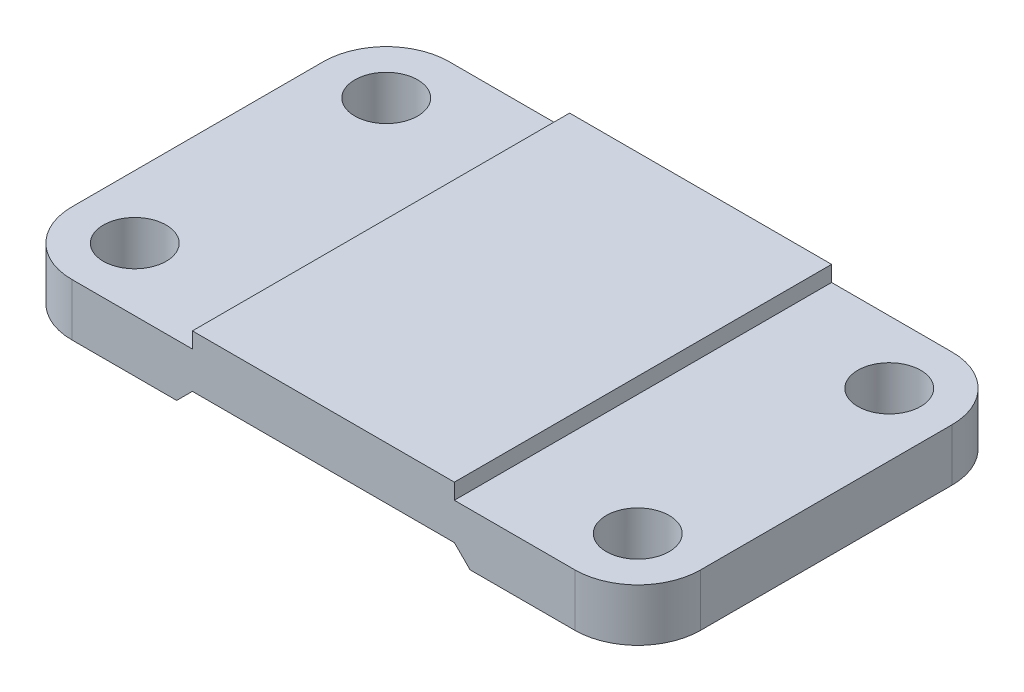
ISO-10303-21;
HEADER;
FILE_DESCRIPTION(('STEP AP214'),'2;1');
FILE_NAME('part.step','',(''),(''),'','','');
FILE_SCHEMA(('AUTOMOTIVE_DESIGN { 1 0 10303 214 1 1 1 1 }'));
ENDSEC;
DATA;
#1=APPLICATION_CONTEXT('core data for automotive mechanical design processes');
#2=APPLICATION_PROTOCOL_DEFINITION('international standard','automotive_design',2000,#1);
#3=PRODUCT_CONTEXT('',#1,'mechanical');
#4=PRODUCT('Part','Part','',(#3));
#5=PRODUCT_RELATED_PRODUCT_CATEGORY('part','',(#4));
#6=PRODUCT_DEFINITION_FORMATION('','',#4);
#7=PRODUCT_DEFINITION_CONTEXT('part definition',#1,'design');
#8=PRODUCT_DEFINITION('design','',#6,#7);
#9=PRODUCT_DEFINITION_SHAPE('','',#8);
#10=(LENGTH_UNIT() NAMED_UNIT(*) SI_UNIT(.MILLI.,.METRE.));
#11=(NAMED_UNIT(*) PLANE_ANGLE_UNIT() SI_UNIT($,.RADIAN.));
#12=(NAMED_UNIT(*) SI_UNIT($,.STERADIAN.) SOLID_ANGLE_UNIT());
#13=UNCERTAINTY_MEASURE_WITH_UNIT(LENGTH_MEASURE(1.E-05),#10,'distance_accuracy_value','');
#14=(GEOMETRIC_REPRESENTATION_CONTEXT(3) GLOBAL_UNCERTAINTY_ASSIGNED_CONTEXT((#13)) GLOBAL_UNIT_ASSIGNED_CONTEXT((#10,
#11,#12)) REPRESENTATION_CONTEXT('',''));
#15=CARTESIAN_POINT('',(0.,0.,0.));
#16=DIRECTION('',(0.,0.,1.));
#17=DIRECTION('',(1.,0.,0.));
#18=AXIS2_PLACEMENT_3D('',#15,#16,#17);
#19=CARTESIAN_POINT('',(32.,0.,72.));
#20=DIRECTION('',(0.,1.,0.));
#21=DIRECTION('',(0.,0.,1.));
#22=AXIS2_PLACEMENT_3D('',#19,#20,#21);
#23=PLANE('',#22);
#24=CARTESIAN_POINT('',(12.,0.,60.));
#25=DIRECTION('',(0.,1.,0.));
#26=DIRECTION('',(0.,0.,1.));
#27=AXIS2_PLACEMENT_3D('',#24,#25,#26);
#28=CIRCLE('',#27,6.);
#29=CARTESIAN_POINT('',(12.,0.,66.));
#30=VERTEX_POINT('',#29);
#31=EDGE_CURVE('E361',#30,#30,#28,.T.);
#32=ORIENTED_EDGE('',*,*,#31,.T.);
#33=EDGE_LOOP('',(#32));
#34=FACE_BOUND('',#33,.T.);
#35=CARTESIAN_POINT('',(12.,0.,12.));
#36=DIRECTION('',(0.,1.,0.));
#37=DIRECTION('',(0.,0.,1.));
#38=AXIS2_PLACEMENT_3D('',#35,#36,#37);
#39=CIRCLE('',#38,6.);
#40=CARTESIAN_POINT('',(12.,0.,18.));
#41=VERTEX_POINT('',#40);
#42=EDGE_CURVE('E352',#41,#41,#39,.T.);
#43=ORIENTED_EDGE('',*,*,#42,.T.);
#44=EDGE_LOOP('',(#43));
#45=FACE_BOUND('',#44,.T.);
#46=CARTESIAN_POINT('',(12.,0.,60.));
#47=DIRECTION('',(0.,1.,0.));
#48=DIRECTION('',(0.,0.,1.));
#49=AXIS2_PLACEMENT_3D('',#46,#47,#48);
#50=CIRCLE('',#49,12.);
#51=CARTESIAN_POINT('',(0.,0.,59.9999999999999));
#52=VERTEX_POINT('',#51);
#53=CARTESIAN_POINT('',(12.,0.,72.));
#54=VERTEX_POINT('',#53);
#55=EDGE_CURVE('E109',#52,#54,#50,.T.);
#56=ORIENTED_EDGE('',*,*,#55,.F.);
#57=DIRECTION('',(0.,0.,-1.));
#58=VECTOR('',#57,1.);
#59=CARTESIAN_POINT('',(0.,0.,72.));
#60=LINE('',#59,#58);
#61=CARTESIAN_POINT('',(0.,0.,12.0000000000001));
#62=VERTEX_POINT('',#61);
#63=EDGE_CURVE('E249',#52,#62,#60,.T.);
#64=ORIENTED_EDGE('',*,*,#63,.T.);
#65=CARTESIAN_POINT('',(12.,0.,12.));
#66=DIRECTION('',(0.,1.,0.));
#67=DIRECTION('',(0.,0.,1.));
#68=AXIS2_PLACEMENT_3D('',#65,#66,#67);
#69=CIRCLE('',#68,12.);
#70=CARTESIAN_POINT('',(12.0000000000001,0.,0.));
#71=VERTEX_POINT('',#70);
#72=EDGE_CURVE('E354',#71,#62,#69,.T.);
#73=ORIENTED_EDGE('',*,*,#72,.F.);
#74=DIRECTION('',(1.,0.,0.));
#75=VECTOR('',#74,1.);
#76=CARTESIAN_POINT('',(32.,0.,0.));
#77=LINE('',#76,#75);
#78=CARTESIAN_POINT('',(32.,0.,0.));
#79=VERTEX_POINT('',#78);
#80=EDGE_CURVE('E326',#71,#79,#77,.T.);
#81=ORIENTED_EDGE('',*,*,#80,.T.);
#82=DIRECTION('',(0.,0.,-1.));
#83=VECTOR('',#82,1.);
#84=CARTESIAN_POINT('',(32.,0.,72.));
#85=LINE('',#84,#83);
#86=CARTESIAN_POINT('',(32.,0.,72.));
#87=VERTEX_POINT('',#86);
#88=EDGE_CURVE('E291',#87,#79,#85,.T.);
#89=ORIENTED_EDGE('',*,*,#88,.F.);
#90=DIRECTION('',(1.,0.,0.));
#91=VECTOR('',#90,1.);
#92=CARTESIAN_POINT('',(32.,0.,72.));
#93=LINE('',#92,#91);
#94=EDGE_CURVE('E248',#54,#87,#93,.T.);
#95=ORIENTED_EDGE('',*,*,#94,.F.);
#96=EDGE_LOOP('',(#56,#64,#73,#81,#89,#95));
#97=FACE_BOUND('',#96,.T.);
#98=ADVANCED_FACE('F87',(#34,#45,#97),#23,.F.);
#99=CARTESIAN_POINT('',(120.,0.,72.));
#100=DIRECTION('',(0.,1.,0.));
#101=DIRECTION('',(-1.,0.,0.));
#102=AXIS2_PLACEMENT_3D('',#99,#100,#101);
#103=PLANE('',#102);
#104=CARTESIAN_POINT('',(108.,0.,12.));
#105=DIRECTION('',(0.,1.,0.));
#106=DIRECTION('',(-1.,0.,0.));
#107=AXIS2_PLACEMENT_3D('',#104,#105,#106);
#108=CIRCLE('',#107,6.);
#109=CARTESIAN_POINT('',(102.,0.,12.));
#110=VERTEX_POINT('',#109);
#111=EDGE_CURVE('E365',#110,#110,#108,.T.);
#112=ORIENTED_EDGE('',*,*,#111,.T.);
#113=EDGE_LOOP('',(#112));
#114=FACE_BOUND('',#113,.T.);
#115=CARTESIAN_POINT('',(108.,0.,60.));
#116=DIRECTION('',(0.,1.,0.));
#117=DIRECTION('',(-1.,0.,0.));
#118=AXIS2_PLACEMENT_3D('',#115,#116,#117);
#119=CIRCLE('',#118,6.);
#120=CARTESIAN_POINT('',(102.,0.,60.));
#121=VERTEX_POINT('',#120);
#122=EDGE_CURVE('E330',#121,#121,#119,.T.);
#123=ORIENTED_EDGE('',*,*,#122,.T.);
#124=EDGE_LOOP('',(#123));
#125=FACE_BOUND('',#124,.T.);
#126=DIRECTION('',(1.,0.,0.));
#127=VECTOR('',#126,1.);
#128=CARTESIAN_POINT('',(120.,0.,0.));
#129=LINE('',#128,#127);
#130=CARTESIAN_POINT('',(88.,0.,0.));
#131=VERTEX_POINT('',#130);
#132=CARTESIAN_POINT('',(108.,0.,0.));
#133=VERTEX_POINT('',#132);
#134=EDGE_CURVE('E229',#131,#133,#129,.T.);
#135=ORIENTED_EDGE('',*,*,#134,.T.);
#136=CARTESIAN_POINT('',(108.,0.,12.));
#137=DIRECTION('',(0.,1.,0.));
#138=DIRECTION('',(-1.,0.,0.));
#139=AXIS2_PLACEMENT_3D('',#136,#137,#138);
#140=CIRCLE('',#139,12.);
#141=CARTESIAN_POINT('',(120.,0.,12.0000000000001));
#142=VERTEX_POINT('',#141);
#143=EDGE_CURVE('E204',#133,#142,#140,.F.);
#144=ORIENTED_EDGE('',*,*,#143,.T.);
#145=DIRECTION('',(0.,0.,-1.));
#146=VECTOR('',#145,1.);
#147=CARTESIAN_POINT('',(120.,0.,72.));
#148=LINE('',#147,#146);
#149=CARTESIAN_POINT('',(120.,0.,59.9999999999999));
#150=VERTEX_POINT('',#149);
#151=EDGE_CURVE('E275',#150,#142,#148,.T.);
#152=ORIENTED_EDGE('',*,*,#151,.F.);
#153=CARTESIAN_POINT('',(108.,0.,60.));
#154=DIRECTION('',(0.,1.,0.));
#155=DIRECTION('',(-1.,0.,0.));
#156=AXIS2_PLACEMENT_3D('',#153,#154,#155);
#157=CIRCLE('',#156,12.);
#158=CARTESIAN_POINT('',(108.,0.,72.));
#159=VERTEX_POINT('',#158);
#160=EDGE_CURVE('E346',#159,#150,#157,.T.);
#161=ORIENTED_EDGE('',*,*,#160,.F.);
#162=DIRECTION('',(1.,0.,0.));
#163=VECTOR('',#162,1.);
#164=CARTESIAN_POINT('',(120.,0.,72.));
#165=LINE('',#164,#163);
#166=CARTESIAN_POINT('',(88.,0.,72.));
#167=VERTEX_POINT('',#166);
#168=EDGE_CURVE('E304',#167,#159,#165,.T.);
#169=ORIENTED_EDGE('',*,*,#168,.F.);
#170=DIRECTION('',(0.,0.,-1.));
#171=VECTOR('',#170,1.);
#172=CARTESIAN_POINT('',(88.,0.,72.));
#173=LINE('',#172,#171);
#174=EDGE_CURVE('E279',#167,#131,#173,.T.);
#175=ORIENTED_EDGE('',*,*,#174,.T.);
#176=EDGE_LOOP('',(#135,#144,#152,#161,#169,#175));
#177=FACE_BOUND('',#176,.T.);
#178=ADVANCED_FACE('F344',(#114,#125,#177),#103,.F.);
#179=CARTESIAN_POINT('',(120.,10.,72.));
#180=DIRECTION('',(-1.,0.,0.));
#181=DIRECTION('',(0.,0.,1.));
#182=AXIS2_PLACEMENT_3D('',#179,#180,#181);
#183=PLANE('',#182);
#184=DIRECTION('',(0.,1.,0.));
#185=VECTOR('',#184,1.);
#186=CARTESIAN_POINT('',(120.,-62.,12.0000000000001));
#187=LINE('',#186,#185);
#188=CARTESIAN_POINT('',(120.,10.,12.0000000000001));
#189=VERTEX_POINT('',#188);
#190=EDGE_CURVE('E221',#142,#189,#187,.T.);
#191=ORIENTED_EDGE('',*,*,#190,.T.);
#192=DIRECTION('',(0.,0.,-1.));
#193=VECTOR('',#192,1.);
#194=CARTESIAN_POINT('',(120.,10.,72.));
#195=LINE('',#194,#193);
#196=CARTESIAN_POINT('',(120.,10.,59.9999999999999));
#197=VERTEX_POINT('',#196);
#198=EDGE_CURVE('E219',#197,#189,#195,.T.);
#199=ORIENTED_EDGE('',*,*,#198,.F.);
#200=DIRECTION('',(0.,1.,0.));
#201=VECTOR('',#200,1.);
#202=CARTESIAN_POINT('',(120.,-62.,59.9999999999999));
#203=LINE('',#202,#201);
#204=EDGE_CURVE('E222',#150,#197,#203,.T.);
#205=ORIENTED_EDGE('',*,*,#204,.F.);
#206=ORIENTED_EDGE('',*,*,#151,.T.);
#207=EDGE_LOOP('',(#191,#199,#205,#206));
#208=FACE_BOUND('',#207,.T.);
#209=ADVANCED_FACE('F441',(#208),#183,.F.);
#210=CARTESIAN_POINT('',(85.,10.,72.));
#211=DIRECTION('',(0.,-1.,0.));
#212=DIRECTION('',(0.,0.,-1.));
#213=AXIS2_PLACEMENT_3D('',#210,#211,#212);
#214=PLANE('',#213);
#215=CARTESIAN_POINT('',(108.,10.,12.));
#216=DIRECTION('',(0.,1.,0.));
#217=DIRECTION('',(0.,0.,1.));
#218=AXIS2_PLACEMENT_3D('',#215,#216,#217);
#219=CIRCLE('',#218,6.);
#220=CARTESIAN_POINT('',(108.,10.,18.));
#221=VERTEX_POINT('',#220);
#222=EDGE_CURVE('E414',#221,#221,#219,.T.);
#223=ORIENTED_EDGE('',*,*,#222,.F.);
#224=EDGE_LOOP('',(#223));
#225=FACE_BOUND('',#224,.T.);
#226=CARTESIAN_POINT('',(108.,10.,60.));
#227=DIRECTION('',(0.,1.,0.));
#228=DIRECTION('',(0.,0.,1.));
#229=AXIS2_PLACEMENT_3D('',#226,#227,#228);
#230=CIRCLE('',#229,6.);
#231=CARTESIAN_POINT('',(108.,10.,66.));
#232=VERTEX_POINT('',#231);
#233=EDGE_CURVE('E426',#232,#232,#230,.T.);
#234=ORIENTED_EDGE('',*,*,#233,.F.);
#235=EDGE_LOOP('',(#234));
#236=FACE_BOUND('',#235,.T.);
#237=ORIENTED_EDGE('',*,*,#198,.T.);
#238=CARTESIAN_POINT('',(108.,10.,12.));
#239=DIRECTION('',(0.,1.,0.));
#240=DIRECTION('',(0.,0.,1.));
#241=AXIS2_PLACEMENT_3D('',#238,#239,#240);
#242=CIRCLE('',#241,12.);
#243=CARTESIAN_POINT('',(108.,10.,0.));
#244=VERTEX_POINT('',#243);
#245=EDGE_CURVE('E201',#244,#189,#242,.F.);
#246=ORIENTED_EDGE('',*,*,#245,.F.);
#247=DIRECTION('',(-1.,0.,0.));
#248=VECTOR('',#247,1.);
#249=CARTESIAN_POINT('',(85.,10.,0.));
#250=LINE('',#249,#248);
#251=CARTESIAN_POINT('',(85.,10.,0.));
#252=VERTEX_POINT('',#251);
#253=EDGE_CURVE('E216',#244,#252,#250,.T.);
#254=ORIENTED_EDGE('',*,*,#253,.T.);
#255=DIRECTION('',(0.,0.,-1.));
#256=VECTOR('',#255,1.);
#257=CARTESIAN_POINT('',(85.,10.,72.));
#258=LINE('',#257,#256);
#259=CARTESIAN_POINT('',(85.,10.,72.));
#260=VERTEX_POINT('',#259);
#261=EDGE_CURVE('E270',#260,#252,#258,.T.);
#262=ORIENTED_EDGE('',*,*,#261,.F.);
#263=DIRECTION('',(-1.,0.,0.));
#264=VECTOR('',#263,1.);
#265=CARTESIAN_POINT('',(85.,10.,72.));
#266=LINE('',#265,#264);
#267=CARTESIAN_POINT('',(108.,10.,72.));
#268=VERTEX_POINT('',#267);
#269=EDGE_CURVE('E302',#268,#260,#266,.T.);
#270=ORIENTED_EDGE('',*,*,#269,.F.);
#271=CARTESIAN_POINT('',(108.,10.,60.));
#272=DIRECTION('',(0.,1.,0.));
#273=DIRECTION('',(0.,0.,1.));
#274=AXIS2_PLACEMENT_3D('',#271,#272,#273);
#275=CIRCLE('',#274,12.);
#276=EDGE_CURVE('E102',#268,#197,#275,.T.);
#277=ORIENTED_EDGE('',*,*,#276,.T.);
#278=EDGE_LOOP('',(#237,#246,#254,#262,#270,#277));
#279=FACE_BOUND('',#278,.T.);
#280=ADVANCED_FACE('F214',(#225,#236,#279),#214,.F.);
#281=CARTESIAN_POINT('',(0.,10.,72.));
#282=DIRECTION('',(0.,-1.,0.));
#283=DIRECTION('',(0.,0.,-1.));
#284=AXIS2_PLACEMENT_3D('',#281,#282,#283);
#285=PLANE('',#284);
#286=CARTESIAN_POINT('',(12.,10.,60.));
#287=DIRECTION('',(0.,1.,0.));
#288=DIRECTION('',(0.,0.,1.));
#289=AXIS2_PLACEMENT_3D('',#286,#287,#288);
#290=CIRCLE('',#289,6.);
#291=CARTESIAN_POINT('',(12.,10.,66.));
#292=VERTEX_POINT('',#291);
#293=EDGE_CURVE('E409',#292,#292,#290,.T.);
#294=ORIENTED_EDGE('',*,*,#293,.F.);
#295=EDGE_LOOP('',(#294));
#296=FACE_BOUND('',#295,.T.);
#297=CARTESIAN_POINT('',(12.,10.,12.));
#298=DIRECTION('',(0.,1.,0.));
#299=DIRECTION('',(0.,0.,1.));
#300=AXIS2_PLACEMENT_3D('',#297,#298,#299);
#301=CIRCLE('',#300,6.);
#302=CARTESIAN_POINT('',(12.,10.,18.));
#303=VERTEX_POINT('',#302);
#304=EDGE_CURVE('E405',#303,#303,#301,.T.);
#305=ORIENTED_EDGE('',*,*,#304,.F.);
#306=EDGE_LOOP('',(#305));
#307=FACE_BOUND('',#306,.T.);
#308=CARTESIAN_POINT('',(12.,10.,60.));
#309=DIRECTION('',(0.,1.,0.));
#310=DIRECTION('',(0.,0.,1.));
#311=AXIS2_PLACEMENT_3D('',#308,#309,#310);
#312=CIRCLE('',#311,12.);
#313=CARTESIAN_POINT('',(0.,10.,59.9999999999999));
#314=VERTEX_POINT('',#313);
#315=CARTESIAN_POINT('',(12.0000000000001,10.,72.));
#316=VERTEX_POINT('',#315);
#317=EDGE_CURVE('E418',#314,#316,#312,.T.);
#318=ORIENTED_EDGE('',*,*,#317,.T.);
#319=DIRECTION('',(-1.,0.,0.));
#320=VECTOR('',#319,1.);
#321=CARTESIAN_POINT('',(0.,10.,72.));
#322=LINE('',#321,#320);
#323=CARTESIAN_POINT('',(35.,10.,72.));
#324=VERTEX_POINT('',#323);
#325=EDGE_CURVE('E254',#324,#316,#322,.T.);
#326=ORIENTED_EDGE('',*,*,#325,.F.);
#327=DIRECTION('',(0.,0.,-1.));
#328=VECTOR('',#327,1.);
#329=CARTESIAN_POINT('',(35.,10.,72.));
#330=LINE('',#329,#328);
#331=CARTESIAN_POINT('',(35.,10.,0.));
#332=VERTEX_POINT('',#331);
#333=EDGE_CURVE('E258',#324,#332,#330,.T.);
#334=ORIENTED_EDGE('',*,*,#333,.T.);
#335=DIRECTION('',(-1.,0.,0.));
#336=VECTOR('',#335,1.);
#337=CARTESIAN_POINT('',(0.,10.,0.));
#338=LINE('',#337,#336);
#339=CARTESIAN_POINT('',(12.0000000000001,10.,0.));
#340=VERTEX_POINT('',#339);
#341=EDGE_CURVE('E244',#332,#340,#338,.T.);
#342=ORIENTED_EDGE('',*,*,#341,.T.);
#343=CARTESIAN_POINT('',(12.,10.,12.));
#344=DIRECTION('',(0.,1.,0.));
#345=DIRECTION('',(0.,0.,1.));
#346=AXIS2_PLACEMENT_3D('',#343,#344,#345);
#347=CIRCLE('',#346,12.);
#348=CARTESIAN_POINT('',(0.,10.,12.0000000000001));
#349=VERTEX_POINT('',#348);
#350=EDGE_CURVE('E399',#340,#349,#347,.T.);
#351=ORIENTED_EDGE('',*,*,#350,.T.);
#352=DIRECTION('',(0.,0.,-1.));
#353=VECTOR('',#352,1.);
#354=CARTESIAN_POINT('',(0.,10.,72.));
#355=LINE('',#354,#353);
#356=EDGE_CURVE('E253',#314,#349,#355,.T.);
#357=ORIENTED_EDGE('',*,*,#356,.F.);
#358=EDGE_LOOP('',(#318,#326,#334,#342,#351,#357));
#359=FACE_BOUND('',#358,.T.);
#360=ADVANCED_FACE('F440',(#296,#307,#359),#285,.F.);
#361=CARTESIAN_POINT('',(0.,0.,72.));
#362=DIRECTION('',(1.,0.,0.));
#363=DIRECTION('',(0.,0.,-1.));
#364=AXIS2_PLACEMENT_3D('',#361,#362,#363);
#365=PLANE('',#364);
#366=ORIENTED_EDGE('',*,*,#63,.F.);
#367=DIRECTION('',(0.,1.,0.));
#368=VECTOR('',#367,1.);
#369=CARTESIAN_POINT('',(0.,-62.,59.9999999999999));
#370=LINE('',#369,#368);
#371=EDGE_CURVE('E410',#52,#314,#370,.T.);
#372=ORIENTED_EDGE('',*,*,#371,.T.);
#373=ORIENTED_EDGE('',*,*,#356,.T.);
#374=DIRECTION('',(0.,1.,0.));
#375=VECTOR('',#374,1.);
#376=CARTESIAN_POINT('',(0.,-62.,12.0000000000001));
#377=LINE('',#376,#375);
#378=EDGE_CURVE('E397',#62,#349,#377,.T.);
#379=ORIENTED_EDGE('',*,*,#378,.F.);
#380=EDGE_LOOP('',(#366,#372,#373,#379));
#381=FACE_BOUND('',#380,.T.);
#382=ADVANCED_FACE('F448',(#381),#365,.F.);
#383=CARTESIAN_POINT('',(0.,0.,72.));
#384=DIRECTION('',(0.,0.,-1.));
#385=DIRECTION('',(-1.,0.,0.));
#386=AXIS2_PLACEMENT_3D('',#383,#384,#385);
#387=PLANE('',#386);
#388=DIRECTION('',(0.,1.,0.));
#389=VECTOR('',#388,1.);
#390=CARTESIAN_POINT('',(12.,-62.,72.));
#391=LINE('',#390,#389);
#392=EDGE_CURVE('E12',#54,#316,#391,.T.);
#393=ORIENTED_EDGE('',*,*,#392,.F.);
#394=ORIENTED_EDGE('',*,*,#94,.T.);
#395=DIRECTION('',(0.707106781186547,0.707106781186548,0.));
#396=VECTOR('',#395,1.);
#397=CARTESIAN_POINT('',(35.,3.00000000000001,72.));
#398=LINE('',#397,#396);
#399=CARTESIAN_POINT('',(35.,3.00000000000001,72.));
#400=VERTEX_POINT('',#399);
#401=EDGE_CURVE('E374',#87,#400,#398,.T.);
#402=ORIENTED_EDGE('',*,*,#401,.T.);
#403=DIRECTION('',(1.,0.,0.));
#404=VECTOR('',#403,1.);
#405=CARTESIAN_POINT('',(85.,3.00000000000001,72.));
#406=LINE('',#405,#404);
#407=CARTESIAN_POINT('',(85.,3.00000000000001,72.));
#408=VERTEX_POINT('',#407);
#409=EDGE_CURVE('E377',#400,#408,#406,.T.);
#410=ORIENTED_EDGE('',*,*,#409,.T.);
#411=DIRECTION('',(0.707106781186546,-0.707106781186549,0.));
#412=VECTOR('',#411,1.);
#413=CARTESIAN_POINT('',(88.,0.,72.));
#414=LINE('',#413,#412);
#415=EDGE_CURVE('E314',#408,#167,#414,.T.);
#416=ORIENTED_EDGE('',*,*,#415,.T.);
#417=ORIENTED_EDGE('',*,*,#168,.T.);
#418=DIRECTION('',(0.,1.,0.));
#419=VECTOR('',#418,1.);
#420=CARTESIAN_POINT('',(108.,-62.,72.));
#421=LINE('',#420,#419);
#422=EDGE_CURVE('E95',#159,#268,#421,.T.);
#423=ORIENTED_EDGE('',*,*,#422,.T.);
#424=ORIENTED_EDGE('',*,*,#269,.T.);
#425=DIRECTION('',(0.,1.,0.));
#426=VECTOR('',#425,1.);
#427=CARTESIAN_POINT('',(85.,13.,72.));
#428=LINE('',#427,#426);
#429=CARTESIAN_POINT('',(85.,13.,72.));
#430=VERTEX_POINT('',#429);
#431=EDGE_CURVE('E308',#260,#430,#428,.T.);
#432=ORIENTED_EDGE('',*,*,#431,.T.);
#433=DIRECTION('',(-1.,0.,0.));
#434=VECTOR('',#433,1.);
#435=CARTESIAN_POINT('',(35.,13.,72.));
#436=LINE('',#435,#434);
#437=CARTESIAN_POINT('',(35.,13.,72.));
#438=VERTEX_POINT('',#437);
#439=EDGE_CURVE('E312',#430,#438,#436,.T.);
#440=ORIENTED_EDGE('',*,*,#439,.T.);
#441=DIRECTION('',(0.,-1.,0.));
#442=VECTOR('',#441,1.);
#443=CARTESIAN_POINT('',(35.,10.,72.));
#444=LINE('',#443,#442);
#445=EDGE_CURVE('E320',#438,#324,#444,.T.);
#446=ORIENTED_EDGE('',*,*,#445,.T.);
#447=ORIENTED_EDGE('',*,*,#325,.T.);
#448=EDGE_LOOP('',(#393,#394,#402,#410,#416,#417,#423,#424,#432,#440,#446,#447));
#449=FACE_BOUND('',#448,.T.);
#450=ADVANCED_FACE('F301',(#449),#387,.F.);
#451=CARTESIAN_POINT('',(0.,0.,0.));
#452=DIRECTION('',(0.,0.,-1.));
#453=DIRECTION('',(-1.,0.,0.));
#454=AXIS2_PLACEMENT_3D('',#451,#452,#453);
#455=PLANE('',#454);
#456=ORIENTED_EDGE('',*,*,#253,.F.);
#457=DIRECTION('',(0.,1.,0.));
#458=VECTOR('',#457,1.);
#459=CARTESIAN_POINT('',(108.,-62.,0.));
#460=LINE('',#459,#458);
#461=EDGE_CURVE('E198',#244,#133,#460,.F.);
#462=ORIENTED_EDGE('',*,*,#461,.T.);
#463=ORIENTED_EDGE('',*,*,#134,.F.);
#464=DIRECTION('',(0.707106781186546,-0.707106781186549,0.));
#465=VECTOR('',#464,1.);
#466=CARTESIAN_POINT('',(88.,0.,0.));
#467=LINE('',#466,#465);
#468=CARTESIAN_POINT('',(85.,3.00000000000001,0.));
#469=VERTEX_POINT('',#468);
#470=EDGE_CURVE('E235',#469,#131,#467,.T.);
#471=ORIENTED_EDGE('',*,*,#470,.F.);
#472=DIRECTION('',(1.,0.,0.));
#473=VECTOR('',#472,1.);
#474=CARTESIAN_POINT('',(85.,3.00000000000001,0.));
#475=LINE('',#474,#473);
#476=CARTESIAN_POINT('',(35.,3.00000000000001,0.));
#477=VERTEX_POINT('',#476);
#478=EDGE_CURVE('E333',#477,#469,#475,.T.);
#479=ORIENTED_EDGE('',*,*,#478,.F.);
#480=DIRECTION('',(0.707106781186547,0.707106781186548,0.));
#481=VECTOR('',#480,1.);
#482=CARTESIAN_POINT('',(35.,3.00000000000001,0.));
#483=LINE('',#482,#481);
#484=EDGE_CURVE('E329',#79,#477,#483,.T.);
#485=ORIENTED_EDGE('',*,*,#484,.F.);
#486=ORIENTED_EDGE('',*,*,#80,.F.);
#487=DIRECTION('',(0.,1.,0.));
#488=VECTOR('',#487,1.);
#489=CARTESIAN_POINT('',(12.,-62.,0.));
#490=LINE('',#489,#488);
#491=EDGE_CURVE('E210',#71,#340,#490,.T.);
#492=ORIENTED_EDGE('',*,*,#491,.T.);
#493=ORIENTED_EDGE('',*,*,#341,.F.);
#494=DIRECTION('',(0.,-1.,0.));
#495=VECTOR('',#494,1.);
#496=CARTESIAN_POINT('',(35.,10.,0.));
#497=LINE('',#496,#495);
#498=CARTESIAN_POINT('',(35.,13.,0.));
#499=VERTEX_POINT('',#498);
#500=EDGE_CURVE('E241',#499,#332,#497,.T.);
#501=ORIENTED_EDGE('',*,*,#500,.F.);
#502=DIRECTION('',(-1.,0.,0.));
#503=VECTOR('',#502,1.);
#504=CARTESIAN_POINT('',(35.,13.,0.));
#505=LINE('',#504,#503);
#506=CARTESIAN_POINT('',(85.,13.,0.));
#507=VERTEX_POINT('',#506);
#508=EDGE_CURVE('E233',#507,#499,#505,.T.);
#509=ORIENTED_EDGE('',*,*,#508,.F.);
#510=DIRECTION('',(0.,1.,0.));
#511=VECTOR('',#510,1.);
#512=CARTESIAN_POINT('',(85.,13.,0.));
#513=LINE('',#512,#511);
#514=EDGE_CURVE('E227',#252,#507,#513,.T.);
#515=ORIENTED_EDGE('',*,*,#514,.F.);
#516=EDGE_LOOP('',(#456,#462,#463,#471,#479,#485,#486,#492,#493,#501,#509,#515));
#517=FACE_BOUND('',#516,.T.);
#518=ADVANCED_FACE('F225',(#517),#455,.T.);
#519=CARTESIAN_POINT('',(35.,3.00000000000001,72.));
#520=DIRECTION('',(-0.707106781186548,0.707106781186547,0.));
#521=DIRECTION('',(-0.707106781186547,-0.707106781186548,0.));
#522=AXIS2_PLACEMENT_3D('',#519,#520,#521);
#523=PLANE('',#522);
#524=ORIENTED_EDGE('',*,*,#484,.T.);
#525=DIRECTION('',(0.,0.,-1.));
#526=VECTOR('',#525,1.);
#527=CARTESIAN_POINT('',(35.,3.00000000000001,72.));
#528=LINE('',#527,#526);
#529=EDGE_CURVE('E287',#400,#477,#528,.T.);
#530=ORIENTED_EDGE('',*,*,#529,.F.);
#531=ORIENTED_EDGE('',*,*,#401,.F.);
#532=ORIENTED_EDGE('',*,*,#88,.T.);
#533=EDGE_LOOP('',(#524,#530,#531,#532));
#534=FACE_BOUND('',#533,.T.);
#535=ADVANCED_FACE('F389',(#534),#523,.F.);
#536=CARTESIAN_POINT('',(85.,3.00000000000001,72.));
#537=DIRECTION('',(0.,1.,0.));
#538=DIRECTION('',(-1.,0.,0.));
#539=AXIS2_PLACEMENT_3D('',#536,#537,#538);
#540=PLANE('',#539);
#541=ORIENTED_EDGE('',*,*,#478,.T.);
#542=DIRECTION('',(0.,0.,-1.));
#543=VECTOR('',#542,1.);
#544=CARTESIAN_POINT('',(85.,3.00000000000001,72.));
#545=LINE('',#544,#543);
#546=EDGE_CURVE('E283',#408,#469,#545,.T.);
#547=ORIENTED_EDGE('',*,*,#546,.F.);
#548=ORIENTED_EDGE('',*,*,#409,.F.);
#549=ORIENTED_EDGE('',*,*,#529,.T.);
#550=EDGE_LOOP('',(#541,#547,#548,#549));
#551=FACE_BOUND('',#550,.T.);
#552=ADVANCED_FACE('F384',(#551),#540,.F.);
#553=CARTESIAN_POINT('',(88.,0.,72.));
#554=DIRECTION('',(0.707106781186549,0.707106781186546,0.));
#555=DIRECTION('',(-0.707106781186546,0.707106781186549,0.));
#556=AXIS2_PLACEMENT_3D('',#553,#554,#555);
#557=PLANE('',#556);
#558=ORIENTED_EDGE('',*,*,#470,.T.);
#559=ORIENTED_EDGE('',*,*,#174,.F.);
#560=ORIENTED_EDGE('',*,*,#415,.F.);
#561=ORIENTED_EDGE('',*,*,#546,.T.);
#562=EDGE_LOOP('',(#558,#559,#560,#561));
#563=FACE_BOUND('',#562,.T.);
#564=ADVANCED_FACE('F339',(#563),#557,.F.);
#565=CARTESIAN_POINT('',(85.,13.,72.));
#566=DIRECTION('',(-1.,0.,0.));
#567=DIRECTION('',(0.,0.,1.));
#568=AXIS2_PLACEMENT_3D('',#565,#566,#567);
#569=PLANE('',#568);
#570=ORIENTED_EDGE('',*,*,#514,.T.);
#571=DIRECTION('',(0.,0.,-1.));
#572=VECTOR('',#571,1.);
#573=CARTESIAN_POINT('',(85.,13.,72.));
#574=LINE('',#573,#572);
#575=EDGE_CURVE('E266',#430,#507,#574,.T.);
#576=ORIENTED_EDGE('',*,*,#575,.F.);
#577=ORIENTED_EDGE('',*,*,#431,.F.);
#578=ORIENTED_EDGE('',*,*,#261,.T.);
#579=EDGE_LOOP('',(#570,#576,#577,#578));
#580=FACE_BOUND('',#579,.T.);
#581=ADVANCED_FACE('F498',(#580),#569,.F.);
#582=CARTESIAN_POINT('',(35.,13.,72.));
#583=DIRECTION('',(0.,-1.,0.));
#584=DIRECTION('',(0.,0.,-1.));
#585=AXIS2_PLACEMENT_3D('',#582,#583,#584);
#586=PLANE('',#585);
#587=ORIENTED_EDGE('',*,*,#508,.T.);
#588=DIRECTION('',(0.,0.,-1.));
#589=VECTOR('',#588,1.);
#590=CARTESIAN_POINT('',(35.,13.,72.));
#591=LINE('',#590,#589);
#592=EDGE_CURVE('E262',#438,#499,#591,.T.);
#593=ORIENTED_EDGE('',*,*,#592,.F.);
#594=ORIENTED_EDGE('',*,*,#439,.F.);
#595=ORIENTED_EDGE('',*,*,#575,.T.);
#596=EDGE_LOOP('',(#587,#593,#594,#595));
#597=FACE_BOUND('',#596,.T.);
#598=ADVANCED_FACE('F495',(#597),#586,.F.);
#599=CARTESIAN_POINT('',(35.,10.,72.));
#600=DIRECTION('',(1.,0.,0.));
#601=DIRECTION('',(0.,0.,-1.));
#602=AXIS2_PLACEMENT_3D('',#599,#600,#601);
#603=PLANE('',#602);
#604=ORIENTED_EDGE('',*,*,#500,.T.);
#605=ORIENTED_EDGE('',*,*,#333,.F.);
#606=ORIENTED_EDGE('',*,*,#445,.F.);
#607=ORIENTED_EDGE('',*,*,#592,.T.);
#608=EDGE_LOOP('',(#604,#605,#606,#607));
#609=FACE_BOUND('',#608,.T.);
#610=ADVANCED_FACE('F485',(#609),#603,.F.);
#611=CARTESIAN_POINT('',(12.,-62.,12.));
#612=DIRECTION('',(0.,1.,0.));
#613=DIRECTION('',(0.,0.,1.));
#614=AXIS2_PLACEMENT_3D('',#611,#612,#613);
#615=CYLINDRICAL_SURFACE('',#614,12.);
#616=ORIENTED_EDGE('',*,*,#72,.T.);
#617=ORIENTED_EDGE('',*,*,#378,.T.);
#618=ORIENTED_EDGE('',*,*,#350,.F.);
#619=ORIENTED_EDGE('',*,*,#491,.F.);
#620=EDGE_LOOP('',(#616,#617,#618,#619));
#621=FACE_BOUND('',#620,.T.);
#622=ADVANCED_FACE('F482',(#621),#615,.T.);
#623=CARTESIAN_POINT('',(108.,-62.,12.));
#624=DIRECTION('',(0.,1.,0.));
#625=DIRECTION('',(0.,0.,1.));
#626=AXIS2_PLACEMENT_3D('',#623,#624,#625);
#627=CYLINDRICAL_SURFACE('',#626,12.);
#628=ORIENTED_EDGE('',*,*,#461,.F.);
#629=ORIENTED_EDGE('',*,*,#245,.T.);
#630=ORIENTED_EDGE('',*,*,#190,.F.);
#631=ORIENTED_EDGE('',*,*,#143,.F.);
#632=EDGE_LOOP('',(#628,#629,#630,#631));
#633=FACE_BOUND('',#632,.T.);
#634=ADVANCED_FACE('F200',(#633),#627,.T.);
#635=CARTESIAN_POINT('',(108.,-62.,60.));
#636=DIRECTION('',(0.,1.,0.));
#637=DIRECTION('',(0.,0.,1.));
#638=AXIS2_PLACEMENT_3D('',#635,#636,#637);
#639=CYLINDRICAL_SURFACE('',#638,12.);
#640=ORIENTED_EDGE('',*,*,#160,.T.);
#641=ORIENTED_EDGE('',*,*,#204,.T.);
#642=ORIENTED_EDGE('',*,*,#276,.F.);
#643=ORIENTED_EDGE('',*,*,#422,.F.);
#644=EDGE_LOOP('',(#640,#641,#642,#643));
#645=FACE_BOUND('',#644,.T.);
#646=ADVANCED_FACE('F479',(#645),#639,.T.);
#647=CARTESIAN_POINT('',(12.,-62.,60.));
#648=DIRECTION('',(0.,1.,0.));
#649=DIRECTION('',(0.,0.,1.));
#650=AXIS2_PLACEMENT_3D('',#647,#648,#649);
#651=CYLINDRICAL_SURFACE('',#650,12.);
#652=ORIENTED_EDGE('',*,*,#55,.T.);
#653=ORIENTED_EDGE('',*,*,#392,.T.);
#654=ORIENTED_EDGE('',*,*,#317,.F.);
#655=ORIENTED_EDGE('',*,*,#371,.F.);
#656=EDGE_LOOP('',(#652,#653,#654,#655));
#657=FACE_BOUND('',#656,.T.);
#658=ADVANCED_FACE('F469',(#657),#651,.T.);
#659=CARTESIAN_POINT('',(12.,-62.,12.));
#660=DIRECTION('',(0.,1.,0.));
#661=DIRECTION('',(0.,0.,1.));
#662=AXIS2_PLACEMENT_3D('',#659,#660,#661);
#663=CYLINDRICAL_SURFACE('',#662,6.);
#664=ORIENTED_EDGE('',*,*,#304,.T.);
#665=EDGE_LOOP('',(#664));
#666=FACE_BOUND('',#665,.T.);
#667=ORIENTED_EDGE('',*,*,#42,.F.);
#668=EDGE_LOOP('',(#667));
#669=FACE_BOUND('',#668,.T.);
#670=ADVANCED_FACE('F466',(#666,#669),#663,.F.);
#671=CARTESIAN_POINT('',(12.,-62.,60.));
#672=DIRECTION('',(0.,1.,0.));
#673=DIRECTION('',(0.,0.,1.));
#674=AXIS2_PLACEMENT_3D('',#671,#672,#673);
#675=CYLINDRICAL_SURFACE('',#674,6.);
#676=ORIENTED_EDGE('',*,*,#293,.T.);
#677=EDGE_LOOP('',(#676));
#678=FACE_BOUND('',#677,.T.);
#679=ORIENTED_EDGE('',*,*,#31,.F.);
#680=EDGE_LOOP('',(#679));
#681=FACE_BOUND('',#680,.T.);
#682=ADVANCED_FACE('F468',(#678,#681),#675,.F.);
#683=CARTESIAN_POINT('',(108.,-62.,12.));
#684=DIRECTION('',(0.,1.,0.));
#685=DIRECTION('',(0.,0.,1.));
#686=AXIS2_PLACEMENT_3D('',#683,#684,#685);
#687=CYLINDRICAL_SURFACE('',#686,6.);
#688=ORIENTED_EDGE('',*,*,#222,.T.);
#689=EDGE_LOOP('',(#688));
#690=FACE_BOUND('',#689,.T.);
#691=ORIENTED_EDGE('',*,*,#111,.F.);
#692=EDGE_LOOP('',(#691));
#693=FACE_BOUND('',#692,.T.);
#694=ADVANCED_FACE('F476',(#690,#693),#687,.F.);
#695=CARTESIAN_POINT('',(108.,-62.,60.));
#696=DIRECTION('',(0.,1.,0.));
#697=DIRECTION('',(0.,0.,1.));
#698=AXIS2_PLACEMENT_3D('',#695,#696,#697);
#699=CYLINDRICAL_SURFACE('',#698,6.);
#700=ORIENTED_EDGE('',*,*,#233,.T.);
#701=EDGE_LOOP('',(#700));
#702=FACE_BOUND('',#701,.T.);
#703=ORIENTED_EDGE('',*,*,#122,.F.);
#704=EDGE_LOOP('',(#703));
#705=FACE_BOUND('',#704,.T.);
#706=ADVANCED_FACE('F436',(#702,#705),#699,.F.);
#707=CLOSED_SHELL('',(#98,#178,#209,#280,#360,#382,#450,#518,#535,#552,#564,#581,#598,#610,#622,
#634,#646,#658,#670,#682,#694,#706));
#708=MANIFOLD_SOLID_BREP('B2',#707);
#709=ADVANCED_BREP_SHAPE_REPRESENTATION('',(#18,#708),#14);
#710=SHAPE_DEFINITION_REPRESENTATION(#9,#709);
ENDSEC;
END-ISO-10303-21;
